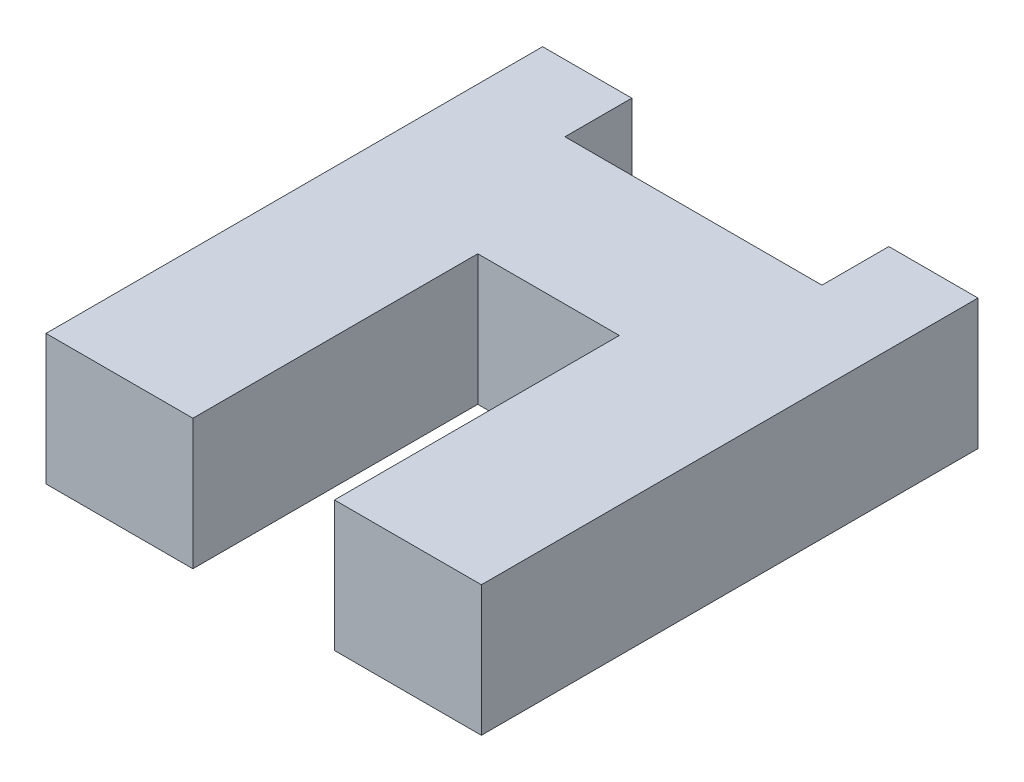
ISO-10303-21;
HEADER;
FILE_DESCRIPTION(('STEP AP214'),'2;1');
FILE_NAME('part.step','',(''),(''),'','','');
FILE_SCHEMA(('AUTOMOTIVE_DESIGN { 1 0 10303 214 1 1 1 1 }'));
ENDSEC;
DATA;
#1=APPLICATION_CONTEXT('core data for automotive mechanical design processes');
#2=APPLICATION_PROTOCOL_DEFINITION('international standard','automotive_design',2000,#1);
#3=PRODUCT_CONTEXT('',#1,'mechanical');
#4=PRODUCT('Part','Part','',(#3));
#5=PRODUCT_RELATED_PRODUCT_CATEGORY('part','',(#4));
#6=PRODUCT_DEFINITION_FORMATION('','',#4);
#7=PRODUCT_DEFINITION_CONTEXT('part definition',#1,'design');
#8=PRODUCT_DEFINITION('design','',#6,#7);
#9=PRODUCT_DEFINITION_SHAPE('','',#8);
#10=(LENGTH_UNIT() NAMED_UNIT(*) SI_UNIT(.MILLI.,.METRE.));
#11=(NAMED_UNIT(*) PLANE_ANGLE_UNIT() SI_UNIT($,.RADIAN.));
#12=(NAMED_UNIT(*) SI_UNIT($,.STERADIAN.) SOLID_ANGLE_UNIT());
#13=UNCERTAINTY_MEASURE_WITH_UNIT(LENGTH_MEASURE(1.E-05),#10,'distance_accuracy_value','');
#14=(GEOMETRIC_REPRESENTATION_CONTEXT(3) GLOBAL_UNCERTAINTY_ASSIGNED_CONTEXT((#13)) GLOBAL_UNIT_ASSIGNED_CONTEXT((#10,
#11,#12)) REPRESENTATION_CONTEXT('',''));
#15=CARTESIAN_POINT('',(0.,0.,0.));
#16=DIRECTION('',(0.,0.,1.));
#17=DIRECTION('',(1.,0.,0.));
#18=AXIS2_PLACEMENT_3D('',#15,#16,#17);
#19=CARTESIAN_POINT('',(-9.765,5.85,9.639));
#20=DIRECTION('',(0.,0.,-1.));
#21=DIRECTION('',(-1.,0.,0.));
#22=AXIS2_PLACEMENT_3D('',#19,#20,#21);
#23=PLANE('',#22);
#24=DIRECTION('',(0.,-1.,0.));
#25=VECTOR('',#24,1.);
#26=CARTESIAN_POINT('',(3.17500000000003,-38.05060801,9.63899999999999));
#27=LINE('',#26,#25);
#28=CARTESIAN_POINT('',(3.17500000000003,5.85,9.63899999999999));
#29=VERTEX_POINT('',#28);
#30=CARTESIAN_POINT('',(3.17500000000003,0.,9.63899999999999));
#31=VERTEX_POINT('',#30);
#32=EDGE_CURVE('E141',#29,#31,#27,.T.);
#33=ORIENTED_EDGE('',*,*,#32,.T.);
#34=DIRECTION('',(1.,0.,0.));
#35=VECTOR('',#34,1.);
#36=CARTESIAN_POINT('',(-9.765,0.,9.639));
#37=LINE('',#36,#35);
#38=CARTESIAN_POINT('',(9.765,0.,9.639));
#39=VERTEX_POINT('',#38);
#40=EDGE_CURVE('E205',#31,#39,#37,.T.);
#41=ORIENTED_EDGE('',*,*,#40,.T.);
#42=DIRECTION('',(0.,-1.,0.));
#43=VECTOR('',#42,1.);
#44=CARTESIAN_POINT('',(9.765,5.85,9.639));
#45=LINE('',#44,#43);
#46=CARTESIAN_POINT('',(9.765,5.85,9.639));
#47=VERTEX_POINT('',#46);
#48=EDGE_CURVE('E209',#47,#39,#45,.T.);
#49=ORIENTED_EDGE('',*,*,#48,.F.);
#50=DIRECTION('',(1.,0.,0.));
#51=VECTOR('',#50,1.);
#52=CARTESIAN_POINT('',(-9.765,5.85,9.639));
#53=LINE('',#52,#51);
#54=EDGE_CURVE('E227',#29,#47,#53,.T.);
#55=ORIENTED_EDGE('',*,*,#54,.F.);
#56=EDGE_LOOP('',(#33,#41,#49,#55));
#57=FACE_BOUND('',#56,.T.);
#58=ADVANCED_FACE('F31',(#57),#23,.F.);
#59=CARTESIAN_POINT('',(9.765,5.85,9.639));
#60=DIRECTION('',(-1.,0.,0.));
#61=DIRECTION('',(0.,0.,1.));
#62=AXIS2_PLACEMENT_3D('',#59,#60,#61);
#63=PLANE('',#62);
#64=DIRECTION('',(0.,0.,-1.));
#65=VECTOR('',#64,1.);
#66=CARTESIAN_POINT('',(9.765,0.,9.639));
#67=LINE('',#66,#65);
#68=CARTESIAN_POINT('',(9.765,0.,-12.639));
#69=VERTEX_POINT('',#68);
#70=EDGE_CURVE('E180',#39,#69,#67,.T.);
#71=ORIENTED_EDGE('',*,*,#70,.T.);
#72=DIRECTION('',(0.,1.,0.));
#73=VECTOR('',#72,1.);
#74=CARTESIAN_POINT('',(9.765,0.,-12.639));
#75=LINE('',#74,#73);
#76=CARTESIAN_POINT('',(9.765,5.85,-12.639));
#77=VERTEX_POINT('',#76);
#78=EDGE_CURVE('E157',#69,#77,#75,.T.);
#79=ORIENTED_EDGE('',*,*,#78,.T.);
#80=DIRECTION('',(0.,0.,-1.));
#81=VECTOR('',#80,1.);
#82=CARTESIAN_POINT('',(9.765,5.85,9.639));
#83=LINE('',#82,#81);
#84=EDGE_CURVE('E185',#47,#77,#83,.T.);
#85=ORIENTED_EDGE('',*,*,#84,.F.);
#86=ORIENTED_EDGE('',*,*,#48,.T.);
#87=EDGE_LOOP('',(#71,#79,#85,#86));
#88=FACE_BOUND('',#87,.T.);
#89=ADVANCED_FACE('F33',(#88),#63,.F.);
#90=CARTESIAN_POINT('',(-9.765,5.85,-9.639));
#91=DIRECTION('',(0.,0.,1.));
#92=DIRECTION('',(1.,0.,0.));
#93=AXIS2_PLACEMENT_3D('',#90,#91,#92);
#94=PLANE('',#93);
#95=DIRECTION('',(-1.,0.,0.));
#96=VECTOR('',#95,1.);
#97=CARTESIAN_POINT('',(-9.765,5.85,-9.639));
#98=LINE('',#97,#96);
#99=CARTESIAN_POINT('',(5.765,5.85,-9.639));
#100=VERTEX_POINT('',#99);
#101=CARTESIAN_POINT('',(-5.765,5.85,-9.639));
#102=VERTEX_POINT('',#101);
#103=EDGE_CURVE('E54',#100,#102,#98,.T.);
#104=ORIENTED_EDGE('',*,*,#103,.F.);
#105=DIRECTION('',(0.,1.,0.));
#106=VECTOR('',#105,1.);
#107=CARTESIAN_POINT('',(5.765,0.,-9.639));
#108=LINE('',#107,#106);
#109=CARTESIAN_POINT('',(5.765,0.,-9.639));
#110=VERTEX_POINT('',#109);
#111=EDGE_CURVE('E162',#110,#100,#108,.T.);
#112=ORIENTED_EDGE('',*,*,#111,.F.);
#113=DIRECTION('',(-1.,0.,0.));
#114=VECTOR('',#113,1.);
#115=CARTESIAN_POINT('',(-9.765,0.,-9.639));
#116=LINE('',#115,#114);
#117=CARTESIAN_POINT('',(-5.765,0.,-9.639));
#118=VERTEX_POINT('',#117);
#119=EDGE_CURVE('E196',#110,#118,#116,.T.);
#120=ORIENTED_EDGE('',*,*,#119,.T.);
#121=DIRECTION('',(0.,1.,0.));
#122=VECTOR('',#121,1.);
#123=CARTESIAN_POINT('',(-5.765,0.,-9.639));
#124=LINE('',#123,#122);
#125=EDGE_CURVE('E172',#118,#102,#124,.T.);
#126=ORIENTED_EDGE('',*,*,#125,.T.);
#127=EDGE_LOOP('',(#104,#112,#120,#126));
#128=FACE_BOUND('',#127,.T.);
#129=ADVANCED_FACE('F244',(#128),#94,.F.);
#130=CARTESIAN_POINT('',(-9.765,5.85,9.639));
#131=DIRECTION('',(1.,0.,0.));
#132=DIRECTION('',(0.,0.,-1.));
#133=AXIS2_PLACEMENT_3D('',#130,#131,#132);
#134=PLANE('',#133);
#135=DIRECTION('',(0.,0.,1.));
#136=VECTOR('',#135,1.);
#137=CARTESIAN_POINT('',(-9.765,0.,9.639));
#138=LINE('',#137,#136);
#139=CARTESIAN_POINT('',(-9.765,0.,-12.639));
#140=VERTEX_POINT('',#139);
#141=CARTESIAN_POINT('',(-9.765,0.,9.639));
#142=VERTEX_POINT('',#141);
#143=EDGE_CURVE('E199',#140,#142,#138,.T.);
#144=ORIENTED_EDGE('',*,*,#143,.T.);
#145=DIRECTION('',(0.,-1.,0.));
#146=VECTOR('',#145,1.);
#147=CARTESIAN_POINT('',(-9.765,5.85,9.639));
#148=LINE('',#147,#146);
#149=CARTESIAN_POINT('',(-9.765,5.85,9.639));
#150=VERTEX_POINT('',#149);
#151=EDGE_CURVE('E212',#150,#142,#148,.T.);
#152=ORIENTED_EDGE('',*,*,#151,.F.);
#153=DIRECTION('',(0.,0.,1.));
#154=VECTOR('',#153,1.);
#155=CARTESIAN_POINT('',(-9.765,5.85,9.639));
#156=LINE('',#155,#154);
#157=CARTESIAN_POINT('',(-9.765,5.85,-12.639));
#158=VERTEX_POINT('',#157);
#159=EDGE_CURVE('E226',#158,#150,#156,.T.);
#160=ORIENTED_EDGE('',*,*,#159,.F.);
#161=DIRECTION('',(0.,1.,0.));
#162=VECTOR('',#161,1.);
#163=CARTESIAN_POINT('',(-9.765,0.,-12.639));
#164=LINE('',#163,#162);
#165=EDGE_CURVE('E177',#140,#158,#164,.T.);
#166=ORIENTED_EDGE('',*,*,#165,.F.);
#167=EDGE_LOOP('',(#144,#152,#160,#166));
#168=FACE_BOUND('',#167,.T.);
#169=ADVANCED_FACE('F224',(#168),#134,.F.);
#170=CARTESIAN_POINT('',(-3.17499999999997,0.,9.63899999999999));
#171=VERTEX_POINT('',#170);
#172=EDGE_CURVE('E206',#142,#171,#37,.T.);
#173=ORIENTED_EDGE('',*,*,#172,.T.);
#174=DIRECTION('',(0.,-1.,0.));
#175=VECTOR('',#174,1.);
#176=CARTESIAN_POINT('',(-3.17499999999997,-38.05060801,9.63899999999999));
#177=LINE('',#176,#175);
#178=CARTESIAN_POINT('',(-3.17499999999997,5.85,9.63899999999999));
#179=VERTEX_POINT('',#178);
#180=EDGE_CURVE('E146',#179,#171,#177,.T.);
#181=ORIENTED_EDGE('',*,*,#180,.F.);
#182=EDGE_CURVE('E139',#150,#179,#53,.T.);
#183=ORIENTED_EDGE('',*,*,#182,.F.);
#184=ORIENTED_EDGE('',*,*,#151,.T.);
#185=EDGE_LOOP('',(#173,#181,#183,#184));
#186=FACE_BOUND('',#185,.T.);
#187=ADVANCED_FACE('F251',(#186),#23,.F.);
#188=CARTESIAN_POINT('',(9.765,5.85,-9.639));
#189=DIRECTION('',(0.,-1.,0.));
#190=DIRECTION('',(0.,0.,-1.));
#191=AXIS2_PLACEMENT_3D('',#188,#189,#190);
#192=PLANE('',#191);
#193=DIRECTION('',(-1.,0.,0.));
#194=VECTOR('',#193,1.);
#195=CARTESIAN_POINT('',(6.82500000000003,5.84999999999999,-3.13900000000001));
#196=LINE('',#195,#194);
#197=CARTESIAN_POINT('',(3.17500000000003,5.84999999999999,-3.13900000000001));
#198=VERTEX_POINT('',#197);
#199=CARTESIAN_POINT('',(-3.17499999999997,5.84999999999999,-3.13900000000001));
#200=VERTEX_POINT('',#199);
#201=EDGE_CURVE('E121',#198,#200,#196,.T.);
#202=ORIENTED_EDGE('',*,*,#201,.F.);
#203=DIRECTION('',(0.,0.,-1.));
#204=VECTOR('',#203,1.);
#205=CARTESIAN_POINT('',(3.17500000000004,5.85,-9.639));
#206=LINE('',#205,#204);
#207=EDGE_CURVE('E140',#29,#198,#206,.T.);
#208=ORIENTED_EDGE('',*,*,#207,.F.);
#209=ORIENTED_EDGE('',*,*,#54,.T.);
#210=ORIENTED_EDGE('',*,*,#84,.T.);
#211=DIRECTION('',(-1.,0.,0.));
#212=VECTOR('',#211,1.);
#213=CARTESIAN_POINT('',(9.765,5.85,-12.639));
#214=LINE('',#213,#212);
#215=CARTESIAN_POINT('',(5.765,5.85,-12.639));
#216=VERTEX_POINT('',#215);
#217=EDGE_CURVE('E143',#77,#216,#214,.T.);
#218=ORIENTED_EDGE('',*,*,#217,.T.);
#219=DIRECTION('',(0.,0.,1.));
#220=VECTOR('',#219,1.);
#221=CARTESIAN_POINT('',(5.765,5.85,-9.639));
#222=LINE('',#221,#220);
#223=EDGE_CURVE('E154',#216,#100,#222,.T.);
#224=ORIENTED_EDGE('',*,*,#223,.T.);
#225=ORIENTED_EDGE('',*,*,#103,.T.);
#226=DIRECTION('',(0.,0.,-1.));
#227=VECTOR('',#226,1.);
#228=CARTESIAN_POINT('',(-5.765,5.85,-9.639));
#229=LINE('',#228,#227);
#230=CARTESIAN_POINT('',(-5.765,5.85,-12.639));
#231=VERTEX_POINT('',#230);
#232=EDGE_CURVE('E164',#102,#231,#229,.T.);
#233=ORIENTED_EDGE('',*,*,#232,.T.);
#234=DIRECTION('',(-1.,0.,0.));
#235=VECTOR('',#234,1.);
#236=CARTESIAN_POINT('',(-9.765,5.85,-12.639));
#237=LINE('',#236,#235);
#238=EDGE_CURVE('E174',#231,#158,#237,.T.);
#239=ORIENTED_EDGE('',*,*,#238,.T.);
#240=ORIENTED_EDGE('',*,*,#159,.T.);
#241=ORIENTED_EDGE('',*,*,#182,.T.);
#242=DIRECTION('',(0.,0.,-1.));
#243=VECTOR('',#242,1.);
#244=CARTESIAN_POINT('',(-3.17499999999996,5.85,-9.639));
#245=LINE('',#244,#243);
#246=EDGE_CURVE('E131',#179,#200,#245,.T.);
#247=ORIENTED_EDGE('',*,*,#246,.T.);
#248=EDGE_LOOP('',(#202,#208,#209,#210,#218,#224,#225,#233,#239,#240,#241,#247));
#249=FACE_BOUND('',#248,.T.);
#250=ADVANCED_FACE('F137',(#249),#192,.F.);
#251=CARTESIAN_POINT('',(9.765,0.,-9.639));
#252=DIRECTION('',(0.,-1.,0.));
#253=DIRECTION('',(0.,0.,-1.));
#254=AXIS2_PLACEMENT_3D('',#251,#252,#253);
#255=PLANE('',#254);
#256=DIRECTION('',(0.,0.,-1.));
#257=VECTOR('',#256,1.);
#258=CARTESIAN_POINT('',(3.17500000000003,0.,-9.639));
#259=LINE('',#258,#257);
#260=CARTESIAN_POINT('',(3.17500000000003,0.,-3.13900000000001));
#261=VERTEX_POINT('',#260);
#262=EDGE_CURVE('E11',#31,#261,#259,.T.);
#263=ORIENTED_EDGE('',*,*,#262,.T.);
#264=DIRECTION('',(-1.,0.,0.));
#265=VECTOR('',#264,1.);
#266=CARTESIAN_POINT('',(6.82500000000003,0.,-3.13900000000001));
#267=LINE('',#266,#265);
#268=CARTESIAN_POINT('',(-3.17499999999997,0.,-3.13900000000001));
#269=VERTEX_POINT('',#268);
#270=EDGE_CURVE('E127',#261,#269,#267,.T.);
#271=ORIENTED_EDGE('',*,*,#270,.T.);
#272=DIRECTION('',(0.,0.,-1.));
#273=VECTOR('',#272,1.);
#274=CARTESIAN_POINT('',(-3.17499999999997,0.,-9.639));
#275=LINE('',#274,#273);
#276=EDGE_CURVE('E39',#171,#269,#275,.T.);
#277=ORIENTED_EDGE('',*,*,#276,.F.);
#278=ORIENTED_EDGE('',*,*,#172,.F.);
#279=ORIENTED_EDGE('',*,*,#143,.F.);
#280=DIRECTION('',(-1.,0.,0.));
#281=VECTOR('',#280,1.);
#282=CARTESIAN_POINT('',(-9.765,0.,-12.639));
#283=LINE('',#282,#281);
#284=CARTESIAN_POINT('',(-5.765,0.,-12.639));
#285=VERTEX_POINT('',#284);
#286=EDGE_CURVE('E169',#285,#140,#283,.T.);
#287=ORIENTED_EDGE('',*,*,#286,.F.);
#288=DIRECTION('',(0.,0.,-1.));
#289=VECTOR('',#288,1.);
#290=CARTESIAN_POINT('',(-5.765,0.,-9.639));
#291=LINE('',#290,#289);
#292=EDGE_CURVE('E173',#118,#285,#291,.T.);
#293=ORIENTED_EDGE('',*,*,#292,.F.);
#294=ORIENTED_EDGE('',*,*,#119,.F.);
#295=DIRECTION('',(0.,0.,1.));
#296=VECTOR('',#295,1.);
#297=CARTESIAN_POINT('',(5.765,0.,-9.639));
#298=LINE('',#297,#296);
#299=CARTESIAN_POINT('',(5.765,0.,-12.639));
#300=VERTEX_POINT('',#299);
#301=EDGE_CURVE('E153',#300,#110,#298,.T.);
#302=ORIENTED_EDGE('',*,*,#301,.F.);
#303=DIRECTION('',(-1.,0.,0.));
#304=VECTOR('',#303,1.);
#305=CARTESIAN_POINT('',(9.765,0.,-12.639));
#306=LINE('',#305,#304);
#307=EDGE_CURVE('E150',#69,#300,#306,.T.);
#308=ORIENTED_EDGE('',*,*,#307,.F.);
#309=ORIENTED_EDGE('',*,*,#70,.F.);
#310=ORIENTED_EDGE('',*,*,#40,.F.);
#311=EDGE_LOOP('',(#263,#271,#277,#278,#279,#287,#293,#294,#302,#308,#309,#310));
#312=FACE_BOUND('',#311,.T.);
#313=ADVANCED_FACE('F248',(#312),#255,.T.);
#314=CARTESIAN_POINT('',(-9.765,0.,-12.639));
#315=DIRECTION('',(0.,0.,-1.));
#316=DIRECTION('',(-1.,0.,0.));
#317=AXIS2_PLACEMENT_3D('',#314,#315,#316);
#318=PLANE('',#317);
#319=ORIENTED_EDGE('',*,*,#238,.F.);
#320=DIRECTION('',(0.,1.,0.));
#321=VECTOR('',#320,1.);
#322=CARTESIAN_POINT('',(-5.765,0.,-12.639));
#323=LINE('',#322,#321);
#324=EDGE_CURVE('E181',#285,#231,#323,.T.);
#325=ORIENTED_EDGE('',*,*,#324,.F.);
#326=ORIENTED_EDGE('',*,*,#286,.T.);
#327=ORIENTED_EDGE('',*,*,#165,.T.);
#328=EDGE_LOOP('',(#319,#325,#326,#327));
#329=FACE_BOUND('',#328,.T.);
#330=ADVANCED_FACE('F220',(#329),#318,.T.);
#331=CARTESIAN_POINT('',(-5.765,0.,-9.639));
#332=DIRECTION('',(1.,0.,0.));
#333=DIRECTION('',(0.,0.,-1.));
#334=AXIS2_PLACEMENT_3D('',#331,#332,#333);
#335=PLANE('',#334);
#336=ORIENTED_EDGE('',*,*,#232,.F.);
#337=ORIENTED_EDGE('',*,*,#125,.F.);
#338=ORIENTED_EDGE('',*,*,#292,.T.);
#339=ORIENTED_EDGE('',*,*,#324,.T.);
#340=EDGE_LOOP('',(#336,#337,#338,#339));
#341=FACE_BOUND('',#340,.T.);
#342=ADVANCED_FACE('F247',(#341),#335,.T.);
#343=CARTESIAN_POINT('',(5.765,0.,-9.639));
#344=DIRECTION('',(-1.,0.,0.));
#345=DIRECTION('',(0.,0.,1.));
#346=AXIS2_PLACEMENT_3D('',#343,#344,#345);
#347=PLANE('',#346);
#348=ORIENTED_EDGE('',*,*,#223,.F.);
#349=DIRECTION('',(0.,1.,0.));
#350=VECTOR('',#349,1.);
#351=CARTESIAN_POINT('',(5.765,0.,-12.639));
#352=LINE('',#351,#350);
#353=EDGE_CURVE('E165',#300,#216,#352,.T.);
#354=ORIENTED_EDGE('',*,*,#353,.F.);
#355=ORIENTED_EDGE('',*,*,#301,.T.);
#356=ORIENTED_EDGE('',*,*,#111,.T.);
#357=EDGE_LOOP('',(#348,#354,#355,#356));
#358=FACE_BOUND('',#357,.T.);
#359=ADVANCED_FACE('F243',(#358),#347,.T.);
#360=CARTESIAN_POINT('',(9.765,0.,-12.639));
#361=DIRECTION('',(0.,0.,-1.));
#362=DIRECTION('',(-1.,0.,0.));
#363=AXIS2_PLACEMENT_3D('',#360,#361,#362);
#364=PLANE('',#363);
#365=ORIENTED_EDGE('',*,*,#217,.F.);
#366=ORIENTED_EDGE('',*,*,#78,.F.);
#367=ORIENTED_EDGE('',*,*,#307,.T.);
#368=ORIENTED_EDGE('',*,*,#353,.T.);
#369=EDGE_LOOP('',(#365,#366,#367,#368));
#370=FACE_BOUND('',#369,.T.);
#371=ADVANCED_FACE('F239',(#370),#364,.T.);
#372=CARTESIAN_POINT('',(3.17500000000003,-44.40060801,22.339));
#373=DIRECTION('',(-1.,0.,0.));
#374=DIRECTION('',(0.,-1.,0.));
#375=AXIS2_PLACEMENT_3D('',#372,#373,#374);
#376=PLANE('',#375);
#377=ORIENTED_EDGE('',*,*,#207,.T.);
#378=DIRECTION('',(0.,1.,0.));
#379=VECTOR('',#378,1.);
#380=CARTESIAN_POINT('',(3.17500000000003,-44.40060801,-3.13900000000001));
#381=LINE('',#380,#379);
#382=EDGE_CURVE('E123',#261,#198,#381,.T.);
#383=ORIENTED_EDGE('',*,*,#382,.F.);
#384=ORIENTED_EDGE('',*,*,#262,.F.);
#385=ORIENTED_EDGE('',*,*,#32,.F.);
#386=EDGE_LOOP('',(#377,#383,#384,#385));
#387=FACE_BOUND('',#386,.T.);
#388=ADVANCED_FACE('F256',(#387),#376,.T.);
#389=CARTESIAN_POINT('',(-3.17499999999997,-44.40060801,22.339));
#390=DIRECTION('',(-1.,0.,0.));
#391=DIRECTION('',(0.,-1.,0.));
#392=AXIS2_PLACEMENT_3D('',#389,#390,#391);
#393=PLANE('',#392);
#394=ORIENTED_EDGE('',*,*,#180,.T.);
#395=ORIENTED_EDGE('',*,*,#276,.T.);
#396=DIRECTION('',(0.,1.,0.));
#397=VECTOR('',#396,1.);
#398=CARTESIAN_POINT('',(-3.17499999999997,5.84999999999999,-3.13900000000001));
#399=LINE('',#398,#397);
#400=EDGE_CURVE('E46',#269,#200,#399,.T.);
#401=ORIENTED_EDGE('',*,*,#400,.T.);
#402=ORIENTED_EDGE('',*,*,#246,.F.);
#403=EDGE_LOOP('',(#394,#395,#401,#402));
#404=FACE_BOUND('',#403,.T.);
#405=ADVANCED_FACE('F130',(#404),#393,.F.);
#406=CARTESIAN_POINT('',(6.82500000000003,5.84999999999999,-3.13900000000001));
#407=DIRECTION('',(0.,0.,1.));
#408=DIRECTION('',(1.,0.,0.));
#409=AXIS2_PLACEMENT_3D('',#406,#407,#408);
#410=PLANE('',#409);
#411=ORIENTED_EDGE('',*,*,#270,.F.);
#412=ORIENTED_EDGE('',*,*,#382,.T.);
#413=ORIENTED_EDGE('',*,*,#201,.T.);
#414=ORIENTED_EDGE('',*,*,#400,.F.);
#415=EDGE_LOOP('',(#411,#412,#413,#414));
#416=FACE_BOUND('',#415,.T.);
#417=ADVANCED_FACE('F122',(#416),#410,.T.);
#418=CLOSED_SHELL('',(#58,#89,#129,#169,#187,#250,#313,#330,#342,#359,#371,#388,#405,#417));
#419=MANIFOLD_SOLID_BREP('B2',#418);
#420=ADVANCED_BREP_SHAPE_REPRESENTATION('',(#18,#419),#14);
#421=SHAPE_DEFINITION_REPRESENTATION(#9,#420);
ENDSEC;
END-ISO-10303-21;
